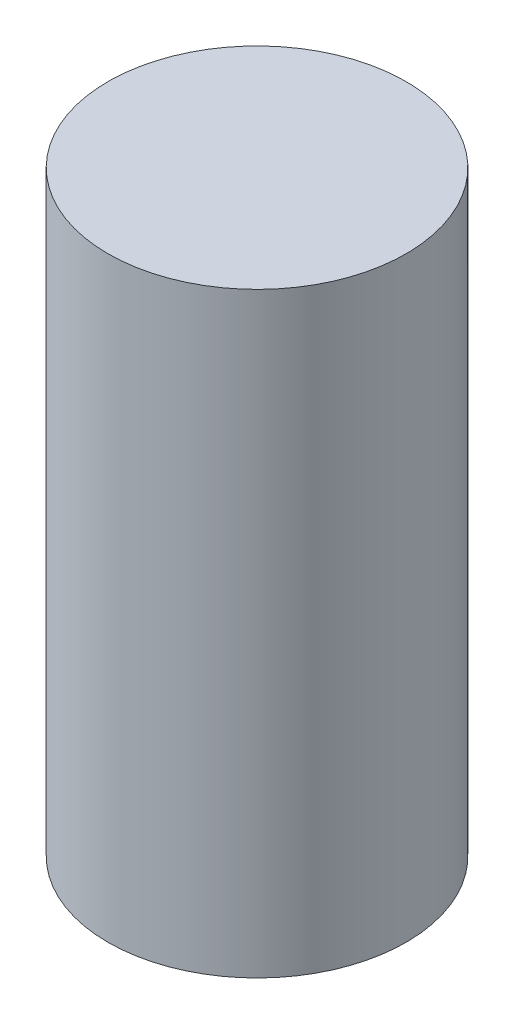
ISO-10303-21;
HEADER;
FILE_DESCRIPTION(('STEP AP214'),'2;1');
FILE_NAME('part.step','',(''),(''),'','','');
FILE_SCHEMA(('AUTOMOTIVE_DESIGN { 1 0 10303 214 1 1 1 1 }'));
ENDSEC;
DATA;
#1=APPLICATION_CONTEXT('core data for automotive mechanical design processes');
#2=APPLICATION_PROTOCOL_DEFINITION('international standard','automotive_design',2000,#1);
#3=PRODUCT_CONTEXT('',#1,'mechanical');
#4=PRODUCT('Part','Part','',(#3));
#5=PRODUCT_RELATED_PRODUCT_CATEGORY('part','',(#4));
#6=PRODUCT_DEFINITION_FORMATION('','',#4);
#7=PRODUCT_DEFINITION_CONTEXT('part definition',#1,'design');
#8=PRODUCT_DEFINITION('design','',#6,#7);
#9=PRODUCT_DEFINITION_SHAPE('','',#8);
#10=(LENGTH_UNIT() NAMED_UNIT(*) SI_UNIT(.MILLI.,.METRE.));
#11=(NAMED_UNIT(*) PLANE_ANGLE_UNIT() SI_UNIT($,.RADIAN.));
#12=(NAMED_UNIT(*) SI_UNIT($,.STERADIAN.) SOLID_ANGLE_UNIT());
#13=UNCERTAINTY_MEASURE_WITH_UNIT(LENGTH_MEASURE(1.E-05),#10,'distance_accuracy_value','');
#14=(GEOMETRIC_REPRESENTATION_CONTEXT(3) GLOBAL_UNCERTAINTY_ASSIGNED_CONTEXT((#13)) GLOBAL_UNIT_ASSIGNED_CONTEXT((#10,
#11,#12)) REPRESENTATION_CONTEXT('',''));
#15=CARTESIAN_POINT('',(0.,0.,0.));
#16=DIRECTION('',(0.,0.,1.));
#17=DIRECTION('',(1.,0.,0.));
#18=AXIS2_PLACEMENT_3D('',#15,#16,#17);
#19=CARTESIAN_POINT('',(0.,30.,0.));
#20=DIRECTION('',(0.,-1.,0.));
#21=DIRECTION('',(0.,0.,-1.));
#22=AXIS2_PLACEMENT_3D('',#19,#20,#21);
#23=CYLINDRICAL_SURFACE('',#22,7.5);
#24=CARTESIAN_POINT('',(0.,30.,0.));
#25=DIRECTION('',(0.,1.,0.));
#26=DIRECTION('',(0.,0.,1.));
#27=AXIS2_PLACEMENT_3D('',#24,#25,#26);
#28=CIRCLE('',#27,7.5);
#29=CARTESIAN_POINT('',(0.,30.,7.5));
#30=VERTEX_POINT('',#29);
#31=EDGE_CURVE('E10',#30,#30,#28,.T.);
#32=ORIENTED_EDGE('',*,*,#31,.F.);
#33=EDGE_LOOP('',(#32));
#34=FACE_BOUND('',#33,.T.);
#35=CARTESIAN_POINT('',(0.,0.,0.));
#36=DIRECTION('',(0.,1.,0.));
#37=DIRECTION('',(0.,0.,1.));
#38=AXIS2_PLACEMENT_3D('',#35,#36,#37);
#39=CIRCLE('',#38,7.5);
#40=CARTESIAN_POINT('',(0.,0.,7.5));
#41=VERTEX_POINT('',#40);
#42=EDGE_CURVE('E40',#41,#41,#39,.T.);
#43=ORIENTED_EDGE('',*,*,#42,.T.);
#44=EDGE_LOOP('',(#43));
#45=FACE_BOUND('',#44,.T.);
#46=ADVANCED_FACE('F37',(#34,#45),#23,.T.);
#47=CARTESIAN_POINT('',(0.,30.,0.));
#48=DIRECTION('',(0.,1.,0.));
#49=DIRECTION('',(0.,0.,1.));
#50=AXIS2_PLACEMENT_3D('',#47,#48,#49);
#51=PLANE('',#50);
#52=ORIENTED_EDGE('',*,*,#31,.T.);
#53=EDGE_LOOP('',(#52));
#54=FACE_BOUND('',#53,.T.);
#55=ADVANCED_FACE('F66',(#54),#51,.T.);
#56=CARTESIAN_POINT('',(0.,0.,0.));
#57=DIRECTION('',(0.,1.,0.));
#58=DIRECTION('',(0.,0.,1.));
#59=AXIS2_PLACEMENT_3D('',#56,#57,#58);
#60=PLANE('',#59);
#61=CARTESIAN_POINT('',(0.,0.,0.));
#62=DIRECTION('',(0.,-1.,0.));
#63=DIRECTION('',(0.,0.,-1.));
#64=AXIS2_PLACEMENT_3D('',#61,#62,#63);
#65=CIRCLE('',#64,2.25);
#66=CARTESIAN_POINT('',(0.,0.,-2.25));
#67=VERTEX_POINT('',#66);
#68=EDGE_CURVE('E49',#67,#67,#65,.T.);
#69=ORIENTED_EDGE('',*,*,#68,.F.);
#70=EDGE_LOOP('',(#69));
#71=FACE_BOUND('',#70,.T.);
#72=ORIENTED_EDGE('',*,*,#42,.F.);
#73=EDGE_LOOP('',(#72));
#74=FACE_BOUND('',#73,.T.);
#75=ADVANCED_FACE('F60',(#71,#74),#60,.F.);
#76=CARTESIAN_POINT('',(0.,20.,0.));
#77=DIRECTION('',(0.,-1.,0.));
#78=DIRECTION('',(0.,0.,-1.));
#79=AXIS2_PLACEMENT_3D('',#76,#77,#78);
#80=CYLINDRICAL_SURFACE('',#79,2.25);
#81=CARTESIAN_POINT('',(0.,20.,0.));
#82=DIRECTION('',(0.,-1.,0.));
#83=DIRECTION('',(0.,0.,-1.));
#84=AXIS2_PLACEMENT_3D('',#81,#82,#83);
#85=CIRCLE('',#84,2.25);
#86=CARTESIAN_POINT('',(0.,20.,-2.25));
#87=VERTEX_POINT('',#86);
#88=EDGE_CURVE('E47',#87,#87,#85,.T.);
#89=ORIENTED_EDGE('',*,*,#88,.F.);
#90=EDGE_LOOP('',(#89));
#91=FACE_BOUND('',#90,.T.);
#92=ORIENTED_EDGE('',*,*,#68,.T.);
#93=EDGE_LOOP('',(#92));
#94=FACE_BOUND('',#93,.T.);
#95=ADVANCED_FACE('F57',(#91,#94),#80,.F.);
#96=CARTESIAN_POINT('',(0.,20.,0.));
#97=DIRECTION('',(0.,-1.,0.));
#98=DIRECTION('',(0.,0.,-1.));
#99=AXIS2_PLACEMENT_3D('',#96,#97,#98);
#100=PLANE('',#99);
#101=ORIENTED_EDGE('',*,*,#88,.T.);
#102=EDGE_LOOP('',(#101));
#103=FACE_BOUND('',#102,.T.);
#104=ADVANCED_FACE('F55',(#103),#100,.T.);
#105=CLOSED_SHELL('',(#46,#55,#75,#95,#104));
#106=MANIFOLD_SOLID_BREP('B2',#105);
#107=ADVANCED_BREP_SHAPE_REPRESENTATION('',(#18,#106),#14);
#108=SHAPE_DEFINITION_REPRESENTATION(#9,#107);
ENDSEC;
END-ISO-10303-21;
